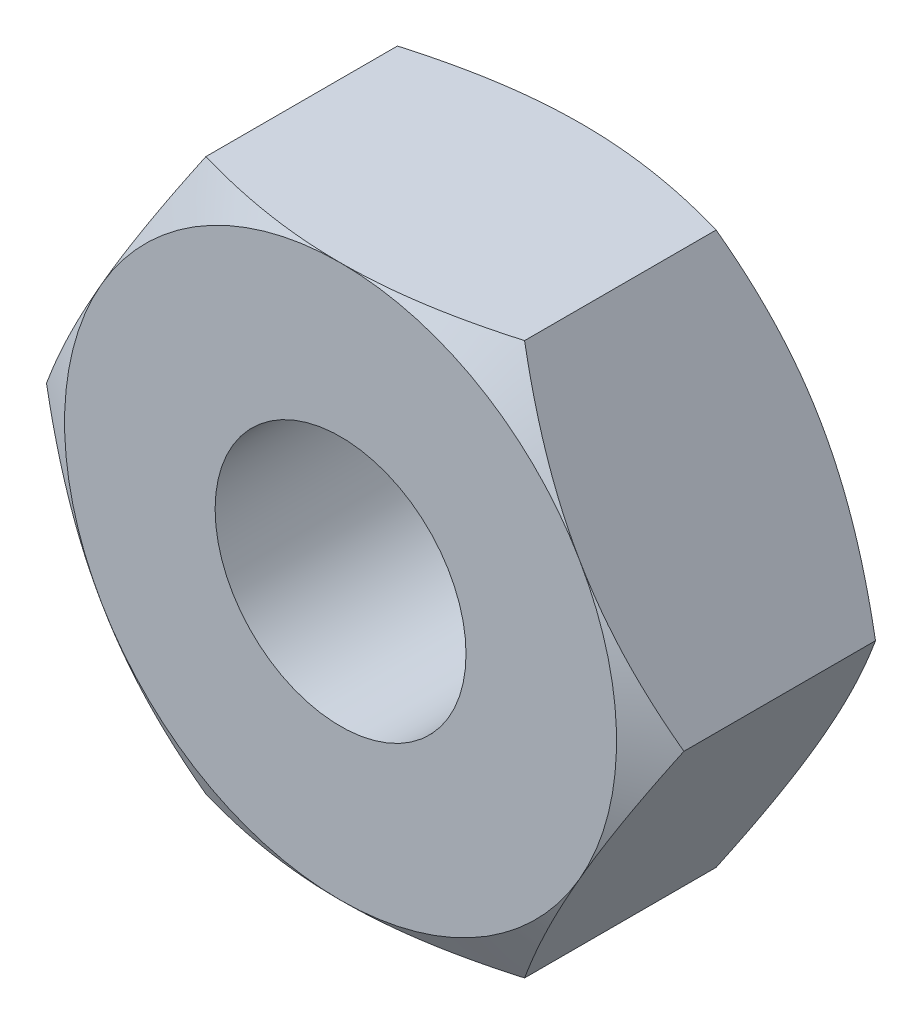
ISO-10303-21;
HEADER;
FILE_DESCRIPTION(('STEP AP214'),'2;1');
FILE_NAME('part.step','',(''),(''),'','','');
FILE_SCHEMA(('AUTOMOTIVE_DESIGN { 1 0 10303 214 1 1 1 1 }'));
ENDSEC;
DATA;
#1=APPLICATION_CONTEXT('core data for automotive mechanical design processes');
#2=APPLICATION_PROTOCOL_DEFINITION('international standard','automotive_design',2000,#1);
#3=PRODUCT_CONTEXT('',#1,'mechanical');
#4=PRODUCT('Part','Part','',(#3));
#5=PRODUCT_RELATED_PRODUCT_CATEGORY('part','',(#4));
#6=PRODUCT_DEFINITION_FORMATION('','',#4);
#7=PRODUCT_DEFINITION_CONTEXT('part definition',#1,'design');
#8=PRODUCT_DEFINITION('design','',#6,#7);
#9=PRODUCT_DEFINITION_SHAPE('','',#8);
#10=(LENGTH_UNIT() NAMED_UNIT(*) SI_UNIT(.MILLI.,.METRE.));
#11=(NAMED_UNIT(*) PLANE_ANGLE_UNIT() SI_UNIT($,.RADIAN.));
#12=(NAMED_UNIT(*) SI_UNIT($,.STERADIAN.) SOLID_ANGLE_UNIT());
#13=UNCERTAINTY_MEASURE_WITH_UNIT(LENGTH_MEASURE(1.E-05),#10,'distance_accuracy_value','');
#14=(GEOMETRIC_REPRESENTATION_CONTEXT(3) GLOBAL_UNCERTAINTY_ASSIGNED_CONTEXT((#13)) GLOBAL_UNIT_ASSIGNED_CONTEXT((#10,
#11,#12)) REPRESENTATION_CONTEXT('',''));
#15=CARTESIAN_POINT('',(0.,0.,0.));
#16=DIRECTION('',(0.,0.,1.));
#17=DIRECTION('',(1.,0.,0.));
#18=AXIS2_PLACEMENT_3D('',#15,#16,#17);
#19=CARTESIAN_POINT('',(0.,0.,2.4));
#20=DIRECTION('',(0.,0.,-1.));
#21=DIRECTION('',(-1.,0.,0.));
#22=AXIS2_PLACEMENT_3D('',#19,#20,#21);
#23=CYLINDRICAL_SURFACE('',#22,1.5);
#24=CARTESIAN_POINT('',(0.,0.,2.4));
#25=DIRECTION('',(0.,0.,-1.));
#26=DIRECTION('',(1.,0.,0.));
#27=AXIS2_PLACEMENT_3D('',#24,#25,#26);
#28=CIRCLE('',#27,1.5);
#29=CARTESIAN_POINT('',(1.5,0.,2.4));
#30=VERTEX_POINT('',#29);
#31=EDGE_CURVE('P0_E11',#30,#30,#28,.T.);
#32=ORIENTED_EDGE('',*,*,#31,.T.);
#33=CARTESIAN_POINT('',(1.5,0.,0.));
#34=DIRECTION('',(0.,0.,1.));
#35=VECTOR('',#34,1.);
#36=LINE('',#33,#35);
#37=CARTESIAN_POINT('',(1.5,0.,0.));
#38=VERTEX_POINT('',#37);
#39=EDGE_CURVE('P0_E24',#38,#30,#36,.T.);
#40=ORIENTED_EDGE('',*,*,#39,.F.);
#41=CARTESIAN_POINT('',(0.,0.,0.));
#42=DIRECTION('',(0.,0.,1.));
#43=DIRECTION('',(1.,0.,0.));
#44=AXIS2_PLACEMENT_3D('',#41,#42,#43);
#45=CIRCLE('',#44,1.5);
#46=EDGE_CURVE('P0_E33',#38,#38,#45,.T.);
#47=ORIENTED_EDGE('',*,*,#46,.T.);
#48=ORIENTED_EDGE('',*,*,#39,.T.);
#49=EDGE_LOOP('',(#32,#40,#47,#48));
#50=FACE_BOUND('',#49,.T.);
#51=ADVANCED_FACE('P0_F16',(#50),#23,.T.);
#52=OPEN_SHELL('',(#51));
#53=SHELL_BASED_SURFACE_MODEL('P0_B1',(#52));
#54=CARTESIAN_POINT('',(-3.175426480543,0.,0.));
#55=DIRECTION('',(-0.866025403784429,-0.500000000000017,0.));
#56=DIRECTION('',(-0.500000000000017,0.866025403784429,0.));
#57=AXIS2_PLACEMENT_3D('',#54,#55,#56);
#58=PLANE('',#57);
#59=CARTESIAN_POINT('',(-1.58771324026058,-2.75000000001884,2.15437990693025));
#60=CARTESIAN_POINT('',(-2.01313972079687,-2.01313972084481,2.4000000000017));
#61=CARTESIAN_POINT('',(-2.38156986038264,-1.37500000004259,2.4000000000093));
#62=(BOUNDED_CURVE() B_SPLINE_CURVE(2,(#59,#60,#61),.UNSPECIFIED.,.F.,
.F.) B_SPLINE_CURVE_WITH_KNOTS((3,3),(-1.21715266220266,-0.886731921722643),
.UNSPECIFIED.) CURVE() GEOMETRIC_REPRESENTATION_ITEM() RATIONAL_B_SPLINE_CURVE((1.92205114398209,
2.07072231736417,2.07072231736912)) REPRESENTATION_ITEM(''));
#63=CARTESIAN_POINT('',(-1.58771324027127,-2.74999999999992,2.15437990693663));
#64=VERTEX_POINT('',#63);
#65=CARTESIAN_POINT('',(-2.38156986036311,-1.37500000001137,2.40000000004685));
#66=VERTEX_POINT('',#65);
#67=EDGE_CURVE('P1_E163',#64,#66,#62,.T.);
#68=ORIENTED_EDGE('',*,*,#67,.T.);
#69=CARTESIAN_POINT('',(-2.38156986038264,-1.37500000004259,2.4000000000093));
#70=CARTESIAN_POINT('',(-2.74999999999116,-0.736860279200976,2.40000000001689));
#71=CARTESIAN_POINT('',(-3.17542648055368,1.85036097932121E-11,2.15437990693033));
#72=(BOUNDED_CURVE() B_SPLINE_CURVE(2,(#69,#70,#71),.UNSPECIFIED.,.F.,
.F.) B_SPLINE_CURVE_WITH_KNOTS((3,3),(-0.886731921722643,-0.556311181220656),
.UNSPECIFIED.) CURVE() GEOMETRIC_REPRESENTATION_ITEM() RATIONAL_B_SPLINE_CURVE((2.07072231736912,
2.07072231737407,1.92205114398213)) REPRESENTATION_ITEM(''));
#73=CARTESIAN_POINT('',(-3.17542648054259,-1.77345257314858E-13,2.15437990693673));
#74=VERTEX_POINT('',#73);
#75=EDGE_CURVE('P1_E183',#66,#74,#72,.T.);
#76=ORIENTED_EDGE('',*,*,#75,.T.);
#77=DIRECTION('',(0.,0.,1.));
#78=VECTOR('',#77,1.);
#79=CARTESIAN_POINT('',(-3.17542648054266,-1.99059518868339E-13,0.));
#80=LINE('',#79,#78);
#81=CARTESIAN_POINT('',(-3.17542648054115,-3.00100569817242E-12,0.245620093085264));
#82=VERTEX_POINT('',#81);
#83=EDGE_CURVE('P1_E29',#82,#74,#80,.T.);
#84=ORIENTED_EDGE('',*,*,#83,.F.);
#85=CARTESIAN_POINT('',(-3.17542648055211,1.57796501546105E-11,0.24562009309159));
#86=CARTESIAN_POINT('',(-2.74999999999052,-0.736860279202072,5.93350534532306E-12));
#87=CARTESIAN_POINT('',(-2.38156986038264,-1.37500000004259,1.35309888161116E-11));
#88=(BOUNDED_CURVE() B_SPLINE_CURVE(2,(#85,#86,#87),.UNSPECIFIED.,.F.,
.F.) B_SPLINE_CURVE_WITH_KNOTS((3,3),(-1.21715266220204,-0.886731921700622),
.UNSPECIFIED.) CURVE() GEOMETRIC_REPRESENTATION_ITEM() RATIONAL_B_SPLINE_CURVE((1.92205114398264,
2.07072231737408,2.07072231736912)) REPRESENTATION_ITEM(''));
#89=CARTESIAN_POINT('',(-2.38156986036311,-1.37500000001137,-2.40251069906494E-11));
#90=VERTEX_POINT('',#89);
#91=EDGE_CURVE('P1_E248',#82,#90,#88,.T.);
#92=ORIENTED_EDGE('',*,*,#91,.T.);
#93=CARTESIAN_POINT('',(-2.38156986038264,-1.37500000004259,1.35309888161116E-11));
#94=CARTESIAN_POINT('',(-2.01313972079724,-2.01313972084417,2.11284045814608E-11));
#95=CARTESIAN_POINT('',(-1.5877132402615,-2.75000000001725,0.245620093092044));
#96=(BOUNDED_CURVE() B_SPLINE_CURVE(2,(#93,#94,#95),.UNSPECIFIED.,.F.,
.F.) B_SPLINE_CURVE_WITH_KNOTS((3,3),(-0.886731921700622,-0.55631118122094),
.UNSPECIFIED.) CURVE() GEOMETRIC_REPRESENTATION_ITEM() RATIONAL_B_SPLINE_CURVE((2.07072231736912,
2.07072231736417,1.92205114398238)) REPRESENTATION_ITEM(''));
#97=CARTESIAN_POINT('',(-1.58771324026963,-2.74999999999728,0.245620093084405));
#98=VERTEX_POINT('',#97);
#99=EDGE_CURVE('P1_E296',#90,#98,#96,.T.);
#100=ORIENTED_EDGE('',*,*,#99,.T.);
#101=DIRECTION('',(0.,0.,-1.));
#102=VECTOR('',#101,1.);
#103=CARTESIAN_POINT('',(-1.587713240271,-2.75,0.));
#104=LINE('',#103,#102);
#105=EDGE_CURVE('P1_E11',#64,#98,#104,.T.);
#106=ORIENTED_EDGE('',*,*,#105,.F.);
#107=EDGE_LOOP('',(#68,#76,#84,#92,#100,#106));
#108=FACE_BOUND('',#107,.T.);
#109=ADVANCED_FACE('P1_F17',(#108),#58,.T.);
#110=CARTESIAN_POINT('',(-1.587713240271,-2.75,0.));
#111=DIRECTION('',(0.,-1.,0.));
#112=DIRECTION('',(0.,0.,-1.));
#113=AXIS2_PLACEMENT_3D('',#110,#111,#112);
#114=PLANE('',#113);
#115=CARTESIAN_POINT('',(1.58771324029258,-2.75,2.15437990693044));
#116=CARTESIAN_POINT('',(0.736860279179178,-2.75,2.40000000001361));
#117=CARTESIAN_POINT('',(-2.77958632249342E-11,-2.75,2.40000000000931));
#118=(BOUNDED_CURVE() B_SPLINE_CURVE(2,(#115,#116,#117),.UNSPECIFIED.,.F.,
.F.) B_SPLINE_CURVE_WITH_KNOTS((3,3),(-1.21715266219766,-0.886731921701514),
.UNSPECIFIED.) CURVE() GEOMETRIC_REPRESENTATION_ITEM() RATIONAL_B_SPLINE_CURVE((1.9220511439767,
2.07072231736602,2.07072231736322)) REPRESENTATION_ITEM(''));
#119=CARTESIAN_POINT('',(1.58771324027082,-2.75,2.15437990693672));
#120=VERTEX_POINT('',#119);
#121=CARTESIAN_POINT('',(-1.80228130045318E-11,-2.74999999996749,2.40000000002808));
#122=VERTEX_POINT('',#121);
#123=EDGE_CURVE('P1_E226',#120,#122,#118,.T.);
#124=ORIENTED_EDGE('',*,*,#123,.T.);
#125=CARTESIAN_POINT('',(-2.77958632249342E-11,-2.75,2.40000000000931));
#126=CARTESIAN_POINT('',(-0.736860279209144,-2.75,2.40000000000501));
#127=CARTESIAN_POINT('',(-1.58771324029302,-2.75,2.15437990693031));
#128=(BOUNDED_CURVE() B_SPLINE_CURVE(2,(#125,#126,#127),.UNSPECIFIED.,.F.,
.F.) B_SPLINE_CURVE_WITH_KNOTS((3,3),(-0.886731921701514,-0.556311181217758),
.UNSPECIFIED.) CURVE() GEOMETRIC_REPRESENTATION_ITEM() RATIONAL_B_SPLINE_CURVE((2.07072231736322,
2.07072231736042,1.92205114397663)) REPRESENTATION_ITEM(''));
#129=EDGE_CURVE('P1_E305',#122,#64,#128,.T.);
#130=ORIENTED_EDGE('',*,*,#129,.T.);
#131=ORIENTED_EDGE('',*,*,#105,.T.);
#132=CARTESIAN_POINT('',(-1.58771324029103,-2.75,0.245620093091943));
#133=CARTESIAN_POINT('',(-0.736860279208345,-2.75,1.78194901443483E-11));
#134=CARTESIAN_POINT('',(-2.77975789130538E-11,-2.75,1.35190862296487E-11));
#135=(BOUNDED_CURVE() B_SPLINE_CURVE(2,(#132,#133,#134),.UNSPECIFIED.,.F.,
.F.) B_SPLINE_CURVE_WITH_KNOTS((3,3),(-1.21715266219738,-0.886731921713979),
.UNSPECIFIED.) CURVE() GEOMETRIC_REPRESENTATION_ITEM() RATIONAL_B_SPLINE_CURVE((1.92205114397696,
2.07072231736042,2.07072231736322)) REPRESENTATION_ITEM(''));
#136=CARTESIAN_POINT('',(-1.80235707547063E-11,-2.74999999996749,-5.25271386460327E-12));
#137=VERTEX_POINT('',#136);
#138=EDGE_CURVE('P1_E254',#98,#137,#135,.T.);
#139=ORIENTED_EDGE('',*,*,#138,.T.);
#140=CARTESIAN_POINT('',(-2.77975789130538E-11,-2.75,1.35190862296487E-11));
#141=CARTESIAN_POINT('',(0.736860281458139,-2.75,9.21879239612623E-12));
#142=CARTESIAN_POINT('',(1.58771324596272,-2.75,0.245620094729218));
#143=(BOUNDED_CURVE() B_SPLINE_CURVE(2,(#140,#141,#142),.UNSPECIFIED.,.F.,
.F.) B_SPLINE_CURVE_WITH_KNOTS((3,3),(-0.886731921713979,-0.556311180195911),
.UNSPECIFIED.) CURVE() GEOMETRIC_REPRESENTATION_ITEM() RATIONAL_B_SPLINE_CURVE((2.07072231736322,
2.07072231736602,1.92205114305708)) REPRESENTATION_ITEM(''));
#144=CARTESIAN_POINT('',(1.58771324276443,-2.74999999896736,0.245620094062304));
#145=VERTEX_POINT('',#144);
#146=EDGE_CURVE('P1_E264',#137,#145,#143,.T.);
#147=ORIENTED_EDGE('',*,*,#146,.T.);
#148=DIRECTION('',(0.,0.,-1.));
#149=VECTOR('',#148,1.);
#150=CARTESIAN_POINT('',(1.587713240271,-2.75,0.));
#151=LINE('',#150,#149);
#152=EDGE_CURVE('P1_E259',#120,#145,#151,.T.);
#153=ORIENTED_EDGE('',*,*,#152,.F.);
#154=EDGE_LOOP('',(#124,#130,#131,#139,#147,#153));
#155=FACE_BOUND('',#154,.T.);
#156=ADVANCED_FACE('P1_F457',(#155),#114,.T.);
#157=CARTESIAN_POINT('',(-1.587713240271,2.75,0.));
#158=DIRECTION('',(-0.866025403784429,0.500000000000017,0.));
#159=DIRECTION('',(0.,0.,1.));
#160=AXIS2_PLACEMENT_3D('',#157,#158,#159);
#161=PLANE('',#160);
#162=CARTESIAN_POINT('',(-3.17542648055351,-1.8994012637515E-11,2.15437990693043));
#163=CARTESIAN_POINT('',(-2.74999999997995,0.736860279219586,2.40000000002343));
#164=CARTESIAN_POINT('',(-2.38156986036192,1.37500000007768,2.40000000000953));
#165=(BOUNDED_CURVE() B_SPLINE_CURVE(2,(#162,#163,#164),.UNSPECIFIED.,.F.,
.F.) B_SPLINE_CURVE_WITH_KNOTS((3,3),(-1.21715266220272,-0.886731921691505),
.UNSPECIFIED.) CURVE() GEOMETRIC_REPRESENTATION_ITEM() RATIONAL_B_SPLINE_CURVE((1.92205114398225,
2.07072231737842,2.07072231736935)) REPRESENTATION_ITEM(''));
#166=CARTESIAN_POINT('',(-2.38156986034973,1.37500000003415,2.40000000004685));
#167=VERTEX_POINT('',#166);
#168=EDGE_CURVE('P1_E179',#74,#167,#165,.T.);
#169=ORIENTED_EDGE('',*,*,#168,.T.);
#170=CARTESIAN_POINT('',(-2.38156986036192,1.37500000007768,2.40000000000953));
#171=CARTESIAN_POINT('',(-2.01313972078559,2.01313972086356,2.39999999999563));
#172=CARTESIAN_POINT('',(-1.58771324026018,2.75000000001875,2.15437990693042));
#173=(BOUNDED_CURVE() B_SPLINE_CURVE(2,(#170,#171,#172),.UNSPECIFIED.,.F.,
.F.) B_SPLINE_CURVE_WITH_KNOTS((3,3),(-0.886731921691505,-0.556311181220575),
.UNSPECIFIED.) CURVE() GEOMETRIC_REPRESENTATION_ITEM() RATIONAL_B_SPLINE_CURVE((2.07072231736935,
2.07072231736028,1.92205114398224)) REPRESENTATION_ITEM(''));
#174=CARTESIAN_POINT('',(-1.58771324027091,2.74999999999985,2.15437990693677));
#175=VERTEX_POINT('',#174);
#176=EDGE_CURVE('P1_E155',#167,#175,#173,.T.);
#177=ORIENTED_EDGE('',*,*,#176,.T.);
#178=DIRECTION('',(0.,0.,1.));
#179=VECTOR('',#178,1.);
#180=CARTESIAN_POINT('',(-1.587713240271,2.75,0.));
#181=LINE('',#180,#179);
#182=CARTESIAN_POINT('',(-1.58771324027225,2.74999999999783,0.245620093085439));
#183=VERTEX_POINT('',#182);
#184=EDGE_CURVE('P1_E42',#183,#175,#181,.T.);
#185=ORIENTED_EDGE('',*,*,#184,.F.);
#186=CARTESIAN_POINT('',(-1.58771324026137,2.75000000001668,0.24562009309172));
#187=CARTESIAN_POINT('',(-2.01313972078607,2.01313972086272,2.72031011665317E-11));
#188=CARTESIAN_POINT('',(-2.38156986036192,1.37500000007768,1.33017299917295E-11));
#189=(BOUNDED_CURVE() B_SPLINE_CURVE(2,(#186,#187,#188),.UNSPECIFIED.,.F.,
.F.) B_SPLINE_CURVE_WITH_KNOTS((3,3),(-1.2171526622023,-0.8867319217318),
.UNSPECIFIED.) CURVE() GEOMETRIC_REPRESENTATION_ITEM() RATIONAL_B_SPLINE_CURVE((1.92205114398263,
2.07072231736029,2.07072231736935)) REPRESENTATION_ITEM(''));
#190=CARTESIAN_POINT('',(-2.38156986034973,1.37500000003415,-2.40251069906494E-11));
#191=VERTEX_POINT('',#190);
#192=EDGE_CURVE('P1_E339',#183,#191,#189,.T.);
#193=ORIENTED_EDGE('',*,*,#192,.T.);
#194=CARTESIAN_POINT('',(-2.38156986036192,1.37500000007768,1.33017299917295E-11));
#195=CARTESIAN_POINT('',(-2.74999999998023,0.73686027921911,-5.99548188873199E-13));
#196=CARTESIAN_POINT('',(-3.17542648055419,-2.01794127754217E-11,0.245620093092793));
#197=(BOUNDED_CURVE() B_SPLINE_CURVE(2,(#194,#195,#196),.UNSPECIFIED.,.F.,
.F.) B_SPLINE_CURVE_WITH_KNOTS((3,3),(-0.8867319217318,-0.556311181220337),
.UNSPECIFIED.) CURVE() GEOMETRIC_REPRESENTATION_ITEM() RATIONAL_B_SPLINE_CURVE((2.07072231736935,
2.07072231737842,1.92205114398203)) REPRESENTATION_ITEM(''));
#198=EDGE_CURVE('P1_E253',#191,#82,#197,.T.);
#199=ORIENTED_EDGE('',*,*,#198,.T.);
#200=ORIENTED_EDGE('',*,*,#83,.T.);
#201=EDGE_LOOP('',(#169,#177,#185,#193,#199,#200));
#202=FACE_BOUND('',#201,.T.);
#203=ADVANCED_FACE('P1_F19',(#202),#161,.T.);
#204=CARTESIAN_POINT('',(1.587713240271,-2.75,0.));
#205=DIRECTION('',(0.866025403784429,-0.500000000000017,0.));
#206=DIRECTION('',(0.,0.,-1.));
#207=AXIS2_PLACEMENT_3D('',#204,#205,#206);
#208=PLANE('',#207);
#209=CARTESIAN_POINT('',(3.17542648055351,1.90063737928642E-11,2.15437990693043));
#210=CARTESIAN_POINT('',(2.74999999997996,-0.736860279219579,2.40000000002343));
#211=CARTESIAN_POINT('',(2.38156986036192,-1.37500000007768,2.40000000000953));
#212=(BOUNDED_CURVE() B_SPLINE_CURVE(2,(#209,#210,#211),.UNSPECIFIED.,.F.,
.F.) B_SPLINE_CURVE_WITH_KNOTS((3,3),(-1.21715266220024,-0.886731921689534),
.UNSPECIFIED.) CURVE() GEOMETRIC_REPRESENTATION_ITEM() RATIONAL_B_SPLINE_CURVE((1.92205114397946,
2.07072231737542,2.07072231736635)) REPRESENTATION_ITEM(''));
#213=CARTESIAN_POINT('',(3.1754264805428,0.,2.15437990693662));
#214=VERTEX_POINT('',#213);
#215=CARTESIAN_POINT('',(2.38156986034973,-1.37500000003415,2.40000000004685));
#216=VERTEX_POINT('',#215);
#217=EDGE_CURVE('P1_E227',#214,#216,#212,.T.);
#218=ORIENTED_EDGE('',*,*,#217,.T.);
#219=CARTESIAN_POINT('',(2.38156986036192,-1.37500000007768,2.40000000000953));
#220=CARTESIAN_POINT('',(2.01313972078555,-2.01313972086361,2.39999999999563));
#221=CARTESIAN_POINT('',(1.58771324026009,-2.7500000000189,2.15437990693037));
#222=(BOUNDED_CURVE() B_SPLINE_CURVE(2,(#219,#220,#221),.UNSPECIFIED.,.F.,
.F.) B_SPLINE_CURVE_WITH_KNOTS((3,3),(-0.886731921689534,-0.556311181219082),
.UNSPECIFIED.) CURVE() GEOMETRIC_REPRESENTATION_ITEM() RATIONAL_B_SPLINE_CURVE((2.07072231736635,
2.07072231735729,1.92205114397943)) REPRESENTATION_ITEM(''));
#223=EDGE_CURVE('P1_E220',#216,#120,#222,.T.);
#224=ORIENTED_EDGE('',*,*,#223,.T.);
#225=ORIENTED_EDGE('',*,*,#152,.T.);
#226=CARTESIAN_POINT('',(2.381569860317,-1.37500000015549,1.33017299942721E-11));
#227=CARTESIAN_POINT('',(2.01313972148474,-2.01313971965259,4.11031208323749E-11));
#228=CARTESIAN_POINT('',(1.58771324205958,-2.74999999690209,0.245620092053524));
#229=(BOUNDED_CURVE() B_SPLINE_CURVE(2,(#226,#227,#228),.UNSPECIFIED.,.F.,
.F.) B_SPLINE_CURVE_WITH_KNOTS((3,3),(0.886731921751946,1.21715266155412),
.UNSPECIFIED.) CURVE() GEOMETRIC_REPRESENTATION_ITEM() RATIONAL_B_SPLINE_CURVE((2.07072231736935,
2.07072231735122,1.92205114456592)) REPRESENTATION_ITEM(''));
#230=CARTESIAN_POINT('',(2.3815698603206,-1.3750000000846,-5.36153683404966E-12));
#231=VERTEX_POINT('',#230);
#232=EDGE_CURVE('P1_E83',#231,#145,#229,.T.);
#233=ORIENTED_EDGE('',*,*,#232,.F.);
#234=CARTESIAN_POINT('',(3.17542648055279,1.77478464463449E-11,0.245620093091982));
#235=CARTESIAN_POINT('',(2.74999999995559,-0.736860279261788,-1.44997902573607E-11));
#236=CARTESIAN_POINT('',(2.381569860317,-1.37500000015549,1.33017299942721E-11));
#237=(BOUNDED_CURVE() B_SPLINE_CURVE(2,(#234,#235,#236),.UNSPECIFIED.,.F.,
.F.) B_SPLINE_CURVE_WITH_KNOTS((3,3),(0.556311181220843,0.886731921751946),
.UNSPECIFIED.) CURVE() GEOMETRIC_REPRESENTATION_ITEM() RATIONAL_B_SPLINE_CURVE((1.92205114398248,
2.07072231738748,2.07072231736935)) REPRESENTATION_ITEM(''));
#238=CARTESIAN_POINT('',(3.17542648054029,1.49602213980809E-13,0.245620093084765));
#239=VERTEX_POINT('',#238);
#240=EDGE_CURVE('P1_E200',#239,#231,#237,.T.);
#241=ORIENTED_EDGE('',*,*,#240,.F.);
#242=DIRECTION('',(0.,0.,-1.));
#243=VECTOR('',#242,1.);
#244=CARTESIAN_POINT('',(3.175426480543,0.,0.));
#245=LINE('',#244,#243);
#246=EDGE_CURVE('P1_E283',#214,#239,#245,.T.);
#247=ORIENTED_EDGE('',*,*,#246,.F.);
#248=EDGE_LOOP('',(#218,#224,#225,#233,#241,#247));
#249=FACE_BOUND('',#248,.T.);
#250=ADVANCED_FACE('P1_F492',(#249),#208,.T.);
#251=CARTESIAN_POINT('',(1.587713240271,2.75,0.));
#252=DIRECTION('',(0.,1.,0.));
#253=DIRECTION('',(1.,0.,0.));
#254=AXIS2_PLACEMENT_3D('',#251,#252,#253);
#255=PLANE('',#254);
#256=CARTESIAN_POINT('',(-1.58771324029264,2.75,2.15437990693042));
#257=CARTESIAN_POINT('',(-0.7368602791792,2.75,2.40000000001361));
#258=CARTESIAN_POINT('',(2.77984367571136E-11,2.75,2.40000000000931));
#259=(BOUNDED_CURVE() B_SPLINE_CURVE(2,(#256,#257,#258),.UNSPECIFIED.,.F.,
.F.) B_SPLINE_CURVE_WITH_KNOTS((3,3),(-1.21715266219767,-0.886731921701513),
.UNSPECIFIED.) CURVE() GEOMETRIC_REPRESENTATION_ITEM() RATIONAL_B_SPLINE_CURVE((1.92205114397669,
2.07072231736602,2.07072231736322)) REPRESENTATION_ITEM(''));
#260=CARTESIAN_POINT('',(1.80235235549317E-11,2.74999999996749,2.40000000002808));
#261=VERTEX_POINT('',#260);
#262=EDGE_CURVE('P1_E161',#175,#261,#259,.T.);
#263=ORIENTED_EDGE('',*,*,#262,.T.);
#264=CARTESIAN_POINT('',(2.77984367571136E-11,2.75,2.40000000000931));
#265=CARTESIAN_POINT('',(0.736860281488445,2.75,2.40000000000501));
#266=CARTESIAN_POINT('',(1.58771324596399,2.75,2.15437990529324));
#267=(BOUNDED_CURVE() B_SPLINE_CURVE(2,(#264,#265,#266),.UNSPECIFIED.,.F.,
.F.) B_SPLINE_CURVE_WITH_KNOTS((3,3),(-0.886731921701513,-0.556311180195681),
.UNSPECIFIED.) CURVE() GEOMETRIC_REPRESENTATION_ITEM() RATIONAL_B_SPLINE_CURVE((2.07072231736322,
2.07072231736042,1.92205114305688)) REPRESENTATION_ITEM(''));
#268=CARTESIAN_POINT('',(1.58771324276521,2.74999999896729,2.15437990596024));
#269=VERTEX_POINT('',#268);
#270=EDGE_CURVE('P1_E21',#261,#269,#267,.T.);
#271=ORIENTED_EDGE('',*,*,#270,.T.);
#272=DIRECTION('',(0.,0.,1.));
#273=VECTOR('',#272,1.);
#274=CARTESIAN_POINT('',(1.58771324027134,2.7500000000002,0.));
#275=LINE('',#274,#273);
#276=CARTESIAN_POINT('',(1.58771323718382,2.75000000136359,0.245620092033229));
#277=VERTEX_POINT('',#276);
#278=EDGE_CURVE('P1_E261',#277,#269,#275,.T.);
#279=ORIENTED_EDGE('',*,*,#278,.F.);
#280=CARTESIAN_POINT('',(2.77984367571136E-11,2.75,1.35190862296487E-11));
#281=CARTESIAN_POINT('',(0.736860276426762,2.75,1.78195728680507E-11));
#282=CARTESIAN_POINT('',(1.58771323337036,2.75,0.245620091094116));
#283=(BOUNDED_CURVE() B_SPLINE_CURVE(2,(#280,#281,#282),.UNSPECIFIED.,.F.,
.F.) B_SPLINE_CURVE_WITH_KNOTS((3,3),(0.886731921713979,1.21715266095007),
.UNSPECIFIED.) CURVE() GEOMETRIC_REPRESENTATION_ITEM() RATIONAL_B_SPLINE_CURVE((2.07072231736322,
2.07072231736042,1.9220511450994)) REPRESENTATION_ITEM(''));
#284=CARTESIAN_POINT('',(1.80232633106214E-11,2.74999999996749,-5.25271292029948E-12));
#285=VERTEX_POINT('',#284);
#286=EDGE_CURVE('P1_E347',#285,#277,#283,.T.);
#287=ORIENTED_EDGE('',*,*,#286,.F.);
#288=CARTESIAN_POINT('',(-1.58771324029372,2.75,0.24562009309272));
#289=CARTESIAN_POINT('',(-0.736860279179634,2.75,9.21865361824815E-12));
#290=CARTESIAN_POINT('',(2.77984367571136E-11,2.75,1.35190862296487E-11));
#291=(BOUNDED_CURVE() B_SPLINE_CURVE(2,(#288,#289,#290),.UNSPECIFIED.,.F.,
.F.) B_SPLINE_CURVE_WITH_KNOTS((3,3),(0.556311181217631,0.886731921713979),
.UNSPECIFIED.) CURVE() GEOMETRIC_REPRESENTATION_ITEM() RATIONAL_B_SPLINE_CURVE((1.92205114397652,
2.07072231736602,2.07072231736322)) REPRESENTATION_ITEM(''));
#292=EDGE_CURVE('P1_E304',#183,#285,#291,.T.);
#293=ORIENTED_EDGE('',*,*,#292,.F.);
#294=ORIENTED_EDGE('',*,*,#184,.T.);
#295=EDGE_LOOP('',(#263,#271,#279,#287,#293,#294));
#296=FACE_BOUND('',#295,.T.);
#297=ADVANCED_FACE('P1_F495',(#296),#255,.T.);
#298=CARTESIAN_POINT('',(0.,0.,0.247093813584343));
#299=DIRECTION('',(0.,0.,1.));
#300=DIRECTION('',(1.,0.,0.));
#301=AXIS2_PLACEMENT_3D('',#298,#299,#300);
#302=CONICAL_SURFACE('',#301,3.1779790393216,1.04719755117736);
#303=CARTESIAN_POINT('',(2.38156986038264,1.37500000004259,1.35309888161116E-11));
#304=CARTESIAN_POINT('',(2.01313971985202,2.01313972248134,2.1128901529337E-11));
#305=CARTESIAN_POINT('',(1.58771323790976,2.75000000409059,0.245620094449822));
#306=(BOUNDED_CURVE() B_SPLINE_CURVE(2,(#303,#304,#305),.UNSPECIFIED.,.F.,
.F.) B_SPLINE_CURVE_WITH_KNOTS((3,3),(0.886731921722644,1.21715266305003),
.UNSPECIFIED.) CURVE() GEOMETRIC_REPRESENTATION_ITEM() RATIONAL_B_SPLINE_CURVE((2.07072231736912,
2.07072231736417,1.92205114321954)) REPRESENTATION_ITEM(''));
#307=CARTESIAN_POINT('',(2.38156986036311,1.37500000001137,-2.40248901502149E-11));
#308=VERTEX_POINT('',#307);
#309=EDGE_CURVE('P1_E265',#308,#277,#306,.T.);
#310=ORIENTED_EDGE('',*,*,#309,.F.);
#311=CARTESIAN_POINT('',(0.,0.,-2.40248901502149E-11));
#312=DIRECTION('',(0.,0.,1.));
#313=DIRECTION('',(1.,0.,0.));
#314=AXIS2_PLACEMENT_3D('',#311,#312,#313);
#315=CIRCLE('',#314,2.74999999993497);
#316=EDGE_CURVE('P1_E243',#308,#285,#315,.T.);
#317=ORIENTED_EDGE('',*,*,#316,.T.);
#318=ORIENTED_EDGE('',*,*,#286,.T.);
#319=EDGE_LOOP('',(#310,#317,#318));
#320=FACE_BOUND('',#319,.T.);
#321=ADVANCED_FACE('P1_F498',(#320),#302,.T.);
#322=CARTESIAN_POINT('',(0.,0.,0.247093813584343));
#323=DIRECTION('',(0.,0.,1.));
#324=DIRECTION('',(1.,0.,0.));
#325=AXIS2_PLACEMENT_3D('',#322,#323,#324);
#326=CONICAL_SURFACE('',#325,3.1779790393216,1.04719755117736);
#327=ORIENTED_EDGE('',*,*,#292,.T.);
#328=CARTESIAN_POINT('',(0.,0.,-2.40248901502149E-11));
#329=DIRECTION('',(0.,0.,1.));
#330=DIRECTION('',(1.,0.,0.));
#331=AXIS2_PLACEMENT_3D('',#328,#329,#330);
#332=CIRCLE('',#331,2.74999999993497);
#333=EDGE_CURVE('P1_E236',#285,#191,#332,.T.);
#334=ORIENTED_EDGE('',*,*,#333,.T.);
#335=ORIENTED_EDGE('',*,*,#192,.F.);
#336=EDGE_LOOP('',(#327,#334,#335));
#337=FACE_BOUND('',#336,.T.);
#338=ADVANCED_FACE('P1_F496',(#337),#326,.T.);
#339=CARTESIAN_POINT('',(0.,0.,0.247093813584343));
#340=DIRECTION('',(0.,0.,1.));
#341=DIRECTION('',(-1.,7.40906191245853E-12,0.));
#342=AXIS2_PLACEMENT_3D('',#339,#340,#341);
#343=CONICAL_SURFACE('',#342,3.1779790393216,1.04719755117736);
#344=ORIENTED_EDGE('',*,*,#91,.F.);
#345=ORIENTED_EDGE('',*,*,#198,.F.);
#346=CARTESIAN_POINT('',(0.,0.,-2.40251069906494E-11));
#347=DIRECTION('',(0.,0.,1.));
#348=DIRECTION('',(1.,0.,0.));
#349=AXIS2_PLACEMENT_3D('',#346,#347,#348);
#350=CIRCLE('',#349,2.74999999993497);
#351=EDGE_CURVE('P1_E213',#191,#90,#350,.T.);
#352=ORIENTED_EDGE('',*,*,#351,.T.);
#353=EDGE_LOOP('',(#344,#345,#352));
#354=FACE_BOUND('',#353,.T.);
#355=ADVANCED_FACE('P1_F490',(#354),#343,.T.);
#356=CARTESIAN_POINT('',(0.,0.,0.247093813584343));
#357=DIRECTION('',(0.,0.,1.));
#358=DIRECTION('',(1.,0.,0.));
#359=AXIS2_PLACEMENT_3D('',#356,#357,#358);
#360=CONICAL_SURFACE('',#359,3.1779790393216,1.04719755117736);
#361=ORIENTED_EDGE('',*,*,#99,.F.);
#362=CARTESIAN_POINT('',(0.,0.,-2.40251069906494E-11));
#363=DIRECTION('',(0.,0.,1.));
#364=DIRECTION('',(1.,0.,0.));
#365=AXIS2_PLACEMENT_3D('',#362,#363,#364);
#366=CIRCLE('',#365,2.74999999993497);
#367=EDGE_CURVE('P1_E206',#90,#137,#366,.T.);
#368=ORIENTED_EDGE('',*,*,#367,.T.);
#369=ORIENTED_EDGE('',*,*,#138,.F.);
#370=EDGE_LOOP('',(#361,#368,#369));
#371=FACE_BOUND('',#370,.T.);
#372=ADVANCED_FACE('P1_F483',(#371),#360,.T.);
#373=CARTESIAN_POINT('',(0.,0.,0.247093813584343));
#374=DIRECTION('',(0.,0.,1.));
#375=DIRECTION('',(1.,0.,0.));
#376=AXIS2_PLACEMENT_3D('',#373,#374,#375);
#377=CONICAL_SURFACE('',#376,3.1779790393216,1.04719755117736);
#378=ORIENTED_EDGE('',*,*,#146,.F.);
#379=CARTESIAN_POINT('',(0.,0.,-2.40248901502149E-11));
#380=DIRECTION('',(0.,0.,1.));
#381=DIRECTION('',(1.,0.,0.));
#382=AXIS2_PLACEMENT_3D('',#379,#380,#381);
#383=CIRCLE('',#382,2.74999999993497);
#384=EDGE_CURVE('P1_E246',#137,#231,#383,.T.);
#385=ORIENTED_EDGE('',*,*,#384,.T.);
#386=ORIENTED_EDGE('',*,*,#232,.T.);
#387=EDGE_LOOP('',(#378,#385,#386));
#388=FACE_BOUND('',#387,.T.);
#389=ADVANCED_FACE('P1_F477',(#388),#377,.T.);
#390=CARTESIAN_POINT('',(3.175426480543,0.,0.));
#391=DIRECTION('',(0.866025403784429,0.500000000000017,0.));
#392=DIRECTION('',(0.,0.,-1.));
#393=AXIS2_PLACEMENT_3D('',#390,#391,#392);
#394=PLANE('',#393);
#395=CARTESIAN_POINT('',(2.38156986038264,1.37500000004259,2.4000000000093));
#396=CARTESIAN_POINT('',(2.01313972152021,2.01313971959194,2.4000000000017));
#397=CARTESIAN_POINT('',(1.58771324206028,2.74999999690166,2.15437990796931));
#398=(BOUNDED_CURVE() B_SPLINE_CURVE(2,(#395,#396,#397),.UNSPECIFIED.,.F.,
.F.) B_SPLINE_CURVE_WITH_KNOTS((3,3),(0.886731921722644,1.21715266155394),
.UNSPECIFIED.) CURVE() GEOMETRIC_REPRESENTATION_ITEM() RATIONAL_B_SPLINE_CURVE((2.07072231736912,
2.07072231736416,1.92205114456586)) REPRESENTATION_ITEM(''));
#399=CARTESIAN_POINT('',(2.38156986036311,1.37500000001137,2.40000000004685));
#400=VERTEX_POINT('',#399);
#401=EDGE_CURVE('P1_E214',#400,#269,#398,.T.);
#402=ORIENTED_EDGE('',*,*,#401,.F.);
#403=CARTESIAN_POINT('',(3.1754264805538,-1.87039298243134E-11,2.15437990693026));
#404=CARTESIAN_POINT('',(2.7499999999912,0.736860279200897,2.40000000001689));
#405=CARTESIAN_POINT('',(2.38156986038264,1.37500000004259,2.4000000000093));
#406=(BOUNDED_CURVE() B_SPLINE_CURVE(2,(#403,#404,#405),.UNSPECIFIED.,.F.,
.F.) B_SPLINE_CURVE_WITH_KNOTS((3,3),(0.556311181220615,0.886731921722644),
.UNSPECIFIED.) CURVE() GEOMETRIC_REPRESENTATION_ITEM() RATIONAL_B_SPLINE_CURVE((1.92205114398209,
2.07072231737407,2.07072231736912)) REPRESENTATION_ITEM(''));
#407=EDGE_CURVE('P1_E314',#214,#400,#406,.T.);
#408=ORIENTED_EDGE('',*,*,#407,.F.);
#409=ORIENTED_EDGE('',*,*,#246,.T.);
#410=CARTESIAN_POINT('',(3.17542648055299,-1.72941804935588E-11,0.245620093092095));
#411=CARTESIAN_POINT('',(2.74999999999087,0.736860279201463,5.93300408802122E-12));
#412=CARTESIAN_POINT('',(2.38156986038264,1.37500000004259,1.35309888161116E-11));
#413=(BOUNDED_CURVE() B_SPLINE_CURVE(2,(#410,#411,#412),.UNSPECIFIED.,.F.,
.F.) B_SPLINE_CURVE_WITH_KNOTS((3,3),(0.556311181220908,0.886731921722644),
.UNSPECIFIED.) CURVE() GEOMETRIC_REPRESENTATION_ITEM() RATIONAL_B_SPLINE_CURVE((1.92205114398236,
2.07072231737408,2.07072231736912)) REPRESENTATION_ITEM(''));
#414=EDGE_CURVE('P1_E219',#239,#308,#413,.T.);
#415=ORIENTED_EDGE('',*,*,#414,.T.);
#416=ORIENTED_EDGE('',*,*,#309,.T.);
#417=ORIENTED_EDGE('',*,*,#278,.T.);
#418=EDGE_LOOP('',(#402,#408,#409,#415,#416,#417));
#419=FACE_BOUND('',#418,.T.);
#420=ADVANCED_FACE('P1_F470',(#419),#394,.T.);
#421=CARTESIAN_POINT('',(0.,0.,0.));
#422=DIRECTION('',(0.,0.,1.));
#423=DIRECTION('',(1.,0.,0.));
#424=AXIS2_PLACEMENT_3D('',#421,#422,#423);
#425=PLANE('',#424);
#426=CARTESIAN_POINT('',(0.,0.,0.));
#427=DIRECTION('',(0.,0.,1.));
#428=DIRECTION('',(1.,0.,0.));
#429=AXIS2_PLACEMENT_3D('',#426,#427,#428);
#430=CIRCLE('',#429,1.25);
#431=CARTESIAN_POINT('',(-1.25,0.,0.));
#432=VERTEX_POINT('',#431);
#433=EDGE_CURVE('P1_E280',#432,#432,#430,.T.);
#434=ORIENTED_EDGE('',*,*,#433,.T.);
#435=EDGE_LOOP('',(#434));
#436=FACE_BOUND('',#435,.T.);
#437=ORIENTED_EDGE('',*,*,#367,.F.);
#438=ORIENTED_EDGE('',*,*,#351,.F.);
#439=ORIENTED_EDGE('',*,*,#333,.F.);
#440=ORIENTED_EDGE('',*,*,#316,.F.);
#441=CARTESIAN_POINT('',(0.,0.,-2.40248901502149E-11));
#442=DIRECTION('',(0.,0.,1.));
#443=DIRECTION('',(1.,0.,0.));
#444=AXIS2_PLACEMENT_3D('',#441,#442,#443);
#445=CIRCLE('',#444,2.74999999993497);
#446=EDGE_CURVE('P1_E215',#231,#308,#445,.T.);
#447=ORIENTED_EDGE('',*,*,#446,.F.);
#448=ORIENTED_EDGE('',*,*,#384,.F.);
#449=EDGE_LOOP('',(#437,#438,#439,#440,#447,#448));
#450=FACE_BOUND('',#449,.T.);
#451=ADVANCED_FACE('P1_F436',(#436,#450),#425,.F.);
#452=CARTESIAN_POINT('',(0.,0.,2.15290618643849));
#453=DIRECTION('',(0.,0.,-1.));
#454=DIRECTION('',(-1.,0.,0.));
#455=AXIS2_PLACEMENT_3D('',#452,#453,#454);
#456=CONICAL_SURFACE('',#455,3.1779790393216,1.04719755117736);
#457=ORIENTED_EDGE('',*,*,#270,.F.);
#458=CARTESIAN_POINT('',(0.,0.,2.40000000004685));
#459=DIRECTION('',(0.,0.,1.));
#460=DIRECTION('',(-1.,0.,0.));
#461=AXIS2_PLACEMENT_3D('',#458,#459,#460);
#462=CIRCLE('',#461,2.74999999993497);
#463=EDGE_CURVE('P1_E174',#400,#261,#462,.T.);
#464=ORIENTED_EDGE('',*,*,#463,.F.);
#465=ORIENTED_EDGE('',*,*,#401,.T.);
#466=EDGE_LOOP('',(#457,#464,#465));
#467=FACE_BOUND('',#466,.T.);
#468=ADVANCED_FACE('P1_F469',(#467),#456,.T.);
#469=CARTESIAN_POINT('',(0.,0.,2.15290618643849));
#470=DIRECTION('',(0.,0.,-1.));
#471=DIRECTION('',(-1.,0.,0.));
#472=AXIS2_PLACEMENT_3D('',#469,#470,#471);
#473=CONICAL_SURFACE('',#472,3.1779790393216,1.04719755117736);
#474=ORIENTED_EDGE('',*,*,#176,.F.);
#475=CARTESIAN_POINT('',(0.,0.,2.40000000004685));
#476=DIRECTION('',(0.,0.,1.));
#477=DIRECTION('',(-1.,0.,0.));
#478=AXIS2_PLACEMENT_3D('',#475,#476,#477);
#479=CIRCLE('',#478,2.74999999993497);
#480=EDGE_CURVE('P1_E158',#261,#167,#479,.T.);
#481=ORIENTED_EDGE('',*,*,#480,.F.);
#482=ORIENTED_EDGE('',*,*,#262,.F.);
#483=EDGE_LOOP('',(#474,#481,#482));
#484=FACE_BOUND('',#483,.T.);
#485=ADVANCED_FACE('P1_F157',(#484),#473,.T.);
#486=CARTESIAN_POINT('',(0.,0.,2.15290618643849));
#487=DIRECTION('',(0.,0.,-1.));
#488=DIRECTION('',(-1.,0.,0.));
#489=AXIS2_PLACEMENT_3D('',#486,#487,#488);
#490=CONICAL_SURFACE('',#489,3.1779790393216,1.04719755117736);
#491=ORIENTED_EDGE('',*,*,#129,.F.);
#492=CARTESIAN_POINT('',(0.,0.,2.40000000004685));
#493=DIRECTION('',(0.,0.,1.));
#494=DIRECTION('',(-1.,0.,0.));
#495=AXIS2_PLACEMENT_3D('',#492,#493,#494);
#496=CIRCLE('',#495,2.74999999993497);
#497=EDGE_CURVE('P1_E176',#66,#122,#496,.T.);
#498=ORIENTED_EDGE('',*,*,#497,.F.);
#499=ORIENTED_EDGE('',*,*,#67,.F.);
#500=EDGE_LOOP('',(#491,#498,#499));
#501=FACE_BOUND('',#500,.T.);
#502=ADVANCED_FACE('P1_F466',(#501),#490,.T.);
#503=CARTESIAN_POINT('',(0.,0.,2.15290618643849));
#504=DIRECTION('',(0.,0.,-1.));
#505=DIRECTION('',(-1.,0.,0.));
#506=AXIS2_PLACEMENT_3D('',#503,#504,#505);
#507=CONICAL_SURFACE('',#506,3.1779790393216,1.04719755117736);
#508=ORIENTED_EDGE('',*,*,#223,.F.);
#509=CARTESIAN_POINT('',(0.,0.,2.40000000004685));
#510=DIRECTION('',(0.,0.,1.));
#511=DIRECTION('',(-1.,0.,0.));
#512=AXIS2_PLACEMENT_3D('',#509,#510,#511);
#513=CIRCLE('',#512,2.74999999993497);
#514=EDGE_CURVE('P1_E197',#122,#216,#513,.T.);
#515=ORIENTED_EDGE('',*,*,#514,.F.);
#516=ORIENTED_EDGE('',*,*,#123,.F.);
#517=EDGE_LOOP('',(#508,#515,#516));
#518=FACE_BOUND('',#517,.T.);
#519=ADVANCED_FACE('P1_F453',(#518),#507,.T.);
#520=CARTESIAN_POINT('',(0.,0.,2.15290618643849));
#521=DIRECTION('',(0.,0.,-1.));
#522=DIRECTION('',(1.,-7.40817373403883E-12,0.));
#523=AXIS2_PLACEMENT_3D('',#520,#521,#522);
#524=CONICAL_SURFACE('',#523,3.1779790393216,1.04719755117736);
#525=ORIENTED_EDGE('',*,*,#407,.T.);
#526=CARTESIAN_POINT('',(0.,0.,2.40000000004685));
#527=DIRECTION('',(0.,0.,1.));
#528=DIRECTION('',(-1.,0.,0.));
#529=AXIS2_PLACEMENT_3D('',#526,#527,#528);
#530=CIRCLE('',#529,2.74999999993497);
#531=EDGE_CURVE('P1_E199',#216,#400,#530,.T.);
#532=ORIENTED_EDGE('',*,*,#531,.F.);
#533=ORIENTED_EDGE('',*,*,#217,.F.);
#534=EDGE_LOOP('',(#525,#532,#533));
#535=FACE_BOUND('',#534,.T.);
#536=ADVANCED_FACE('P1_F444',(#535),#524,.T.);
#537=CARTESIAN_POINT('',(0.,0.,2.4));
#538=DIRECTION('',(0.,0.,1.));
#539=DIRECTION('',(1.,0.,0.));
#540=AXIS2_PLACEMENT_3D('',#537,#538,#539);
#541=PLANE('',#540);
#542=CARTESIAN_POINT('',(0.,0.,2.4));
#543=DIRECTION('',(0.,0.,-1.));
#544=DIRECTION('',(1.,0.,0.));
#545=AXIS2_PLACEMENT_3D('',#542,#543,#544);
#546=CIRCLE('',#545,1.25);
#547=CARTESIAN_POINT('',(-1.25,0.,2.4));
#548=VERTEX_POINT('',#547);
#549=EDGE_CURVE('P1_E187',#548,#548,#546,.T.);
#550=ORIENTED_EDGE('',*,*,#549,.T.);
#551=EDGE_LOOP('',(#550));
#552=FACE_BOUND('',#551,.T.);
#553=ORIENTED_EDGE('',*,*,#514,.T.);
#554=ORIENTED_EDGE('',*,*,#531,.T.);
#555=ORIENTED_EDGE('',*,*,#463,.T.);
#556=ORIENTED_EDGE('',*,*,#480,.T.);
#557=CARTESIAN_POINT('',(0.,0.,2.40000000004685));
#558=DIRECTION('',(0.,0.,1.));
#559=DIRECTION('',(-1.,0.,0.));
#560=AXIS2_PLACEMENT_3D('',#557,#558,#559);
#561=CIRCLE('',#560,2.74999999993497);
#562=EDGE_CURVE('P1_E171',#167,#66,#561,.T.);
#563=ORIENTED_EDGE('',*,*,#562,.T.);
#564=ORIENTED_EDGE('',*,*,#497,.T.);
#565=EDGE_LOOP('',(#553,#554,#555,#556,#563,#564));
#566=FACE_BOUND('',#565,.T.);
#567=ADVANCED_FACE('P1_F168',(#552,#566),#541,.T.);
#568=CARTESIAN_POINT('',(0.,0.,0.247093813584343));
#569=DIRECTION('',(0.,0.,1.));
#570=DIRECTION('',(1.,0.,0.));
#571=AXIS2_PLACEMENT_3D('',#568,#569,#570);
#572=CONICAL_SURFACE('',#571,3.1779790393216,1.04719755117736);
#573=ORIENTED_EDGE('',*,*,#446,.T.);
#574=ORIENTED_EDGE('',*,*,#414,.F.);
#575=ORIENTED_EDGE('',*,*,#240,.T.);
#576=EDGE_LOOP('',(#573,#574,#575));
#577=FACE_BOUND('',#576,.T.);
#578=ADVANCED_FACE('P1_F443',(#577),#572,.T.);
#579=CARTESIAN_POINT('',(0.,0.,2.15290618643849));
#580=DIRECTION('',(0.,0.,-1.));
#581=DIRECTION('',(-1.,0.,0.));
#582=AXIS2_PLACEMENT_3D('',#579,#580,#581);
#583=CONICAL_SURFACE('',#582,3.1779790393216,1.04719755117736);
#584=ORIENTED_EDGE('',*,*,#562,.F.);
#585=ORIENTED_EDGE('',*,*,#168,.F.);
#586=ORIENTED_EDGE('',*,*,#75,.F.);
#587=EDGE_LOOP('',(#584,#585,#586));
#588=FACE_BOUND('',#587,.T.);
#589=ADVANCED_FACE('P1_F185',(#588),#583,.T.);
#590=CARTESIAN_POINT('',(0.,0.,2.4));
#591=DIRECTION('',(0.,0.,1.));
#592=DIRECTION('',(1.,0.,0.));
#593=AXIS2_PLACEMENT_3D('',#590,#591,#592);
#594=CYLINDRICAL_SURFACE('',#593,1.25);
#595=ORIENTED_EDGE('',*,*,#433,.F.);
#596=DIRECTION('',(0.,0.,1.));
#597=VECTOR('',#596,1.);
#598=CARTESIAN_POINT('',(-1.25,0.,2.4));
#599=LINE('',#598,#597);
#600=EDGE_CURVE('P1_E193',#432,#548,#599,.T.);
#601=ORIENTED_EDGE('',*,*,#600,.T.);
#602=ORIENTED_EDGE('',*,*,#549,.F.);
#603=ORIENTED_EDGE('',*,*,#600,.F.);
#604=EDGE_LOOP('',(#595,#601,#602,#603));
#605=FACE_BOUND('',#604,.T.);
#606=ADVANCED_FACE('P1_F439',(#605),#594,.F.);
#607=CLOSED_SHELL('',(#109,#156,#203,#250,#297,#321,#338,#355,#372,#389,#420,#451,#468,#485,
#502,#519,#536,#567,#578,#589,#606));
#608=MANIFOLD_SOLID_BREP('P1_B1',#607);
#609=ADVANCED_BREP_SHAPE_REPRESENTATION('',(#18,#608),#14);
#610=MANIFOLD_SURFACE_SHAPE_REPRESENTATION('',(#18,#53),#14);
#611=SHAPE_REPRESENTATION('',(#18),#14);
#612=SHAPE_DEFINITION_REPRESENTATION(#9,#611);
#613=SHAPE_REPRESENTATION_RELATIONSHIP('','',#611,#609);
#614=SHAPE_REPRESENTATION_RELATIONSHIP('','',#611,#610);
ENDSEC;
END-ISO-10303-21;
